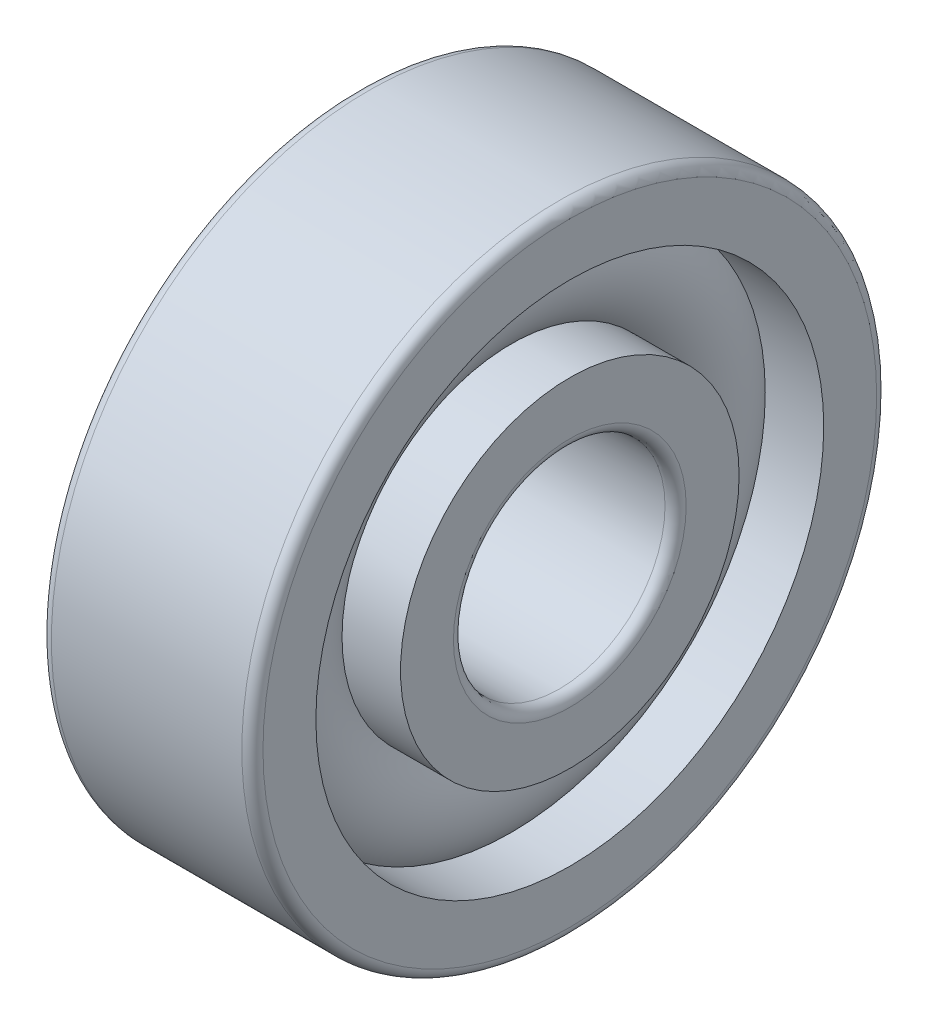
ISO-10303-21;
HEADER;
FILE_DESCRIPTION(('STEP AP214'),'2;1');
FILE_NAME('part.step','',(''),(''),'','','');
FILE_SCHEMA(('AUTOMOTIVE_DESIGN { 1 0 10303 214 1 1 1 1 }'));
ENDSEC;
DATA;
#1=APPLICATION_CONTEXT('core data for automotive mechanical design processes');
#2=APPLICATION_PROTOCOL_DEFINITION('international standard','automotive_design',2000,#1);
#3=PRODUCT_CONTEXT('',#1,'mechanical');
#4=PRODUCT('Part','Part','',(#3));
#5=PRODUCT_RELATED_PRODUCT_CATEGORY('part','',(#4));
#6=PRODUCT_DEFINITION_FORMATION('','',#4);
#7=PRODUCT_DEFINITION_CONTEXT('part definition',#1,'design');
#8=PRODUCT_DEFINITION('design','',#6,#7);
#9=PRODUCT_DEFINITION_SHAPE('','',#8);
#10=(LENGTH_UNIT() NAMED_UNIT(*) SI_UNIT(.MILLI.,.METRE.));
#11=(NAMED_UNIT(*) PLANE_ANGLE_UNIT() SI_UNIT($,.RADIAN.));
#12=(NAMED_UNIT(*) SI_UNIT($,.STERADIAN.) SOLID_ANGLE_UNIT());
#13=UNCERTAINTY_MEASURE_WITH_UNIT(LENGTH_MEASURE(1.E-05),#10,'distance_accuracy_value','');
#14=(GEOMETRIC_REPRESENTATION_CONTEXT(3) GLOBAL_UNCERTAINTY_ASSIGNED_CONTEXT((#13)) GLOBAL_UNIT_ASSIGNED_CONTEXT((#10,
#11,#12)) REPRESENTATION_CONTEXT('',''));
#15=CARTESIAN_POINT('',(0.,0.,0.));
#16=DIRECTION('',(0.,0.,1.));
#17=DIRECTION('',(1.,0.,0.));
#18=AXIS2_PLACEMENT_3D('',#15,#16,#17);
#19=CARTESIAN_POINT('',(0.,0.,0.));
#20=DIRECTION('',(-1.,0.,0.));
#21=DIRECTION('',(0.,0.,1.));
#22=AXIS2_PLACEMENT_3D('',#19,#20,#21);
#23=TOROIDAL_SURFACE('',#22,4.,1.2);
#24=CARTESIAN_POINT('',(0.894427190999912,0.,0.));
#25=DIRECTION('',(-1.,0.,0.));
#26=DIRECTION('',(0.,0.,1.));
#27=AXIS2_PLACEMENT_3D('',#24,#25,#26);
#28=CIRCLE('',#27,4.8);
#29=CARTESIAN_POINT('',(0.894427190999912,0.,4.8));
#30=VERTEX_POINT('',#29);
#31=EDGE_CURVE('E35',#30,#30,#28,.F.);
#32=ORIENTED_EDGE('',*,*,#31,.T.);
#33=EDGE_LOOP('',(#32));
#34=FACE_BOUND('',#33,.T.);
#35=CARTESIAN_POINT('',(0.894427190999916,0.,0.));
#36=DIRECTION('',(-1.,0.,0.));
#37=DIRECTION('',(0.,0.,1.));
#38=AXIS2_PLACEMENT_3D('',#35,#36,#37);
#39=CIRCLE('',#38,3.2);
#40=CARTESIAN_POINT('',(0.894427190999916,0.,3.2));
#41=VERTEX_POINT('',#40);
#42=EDGE_CURVE('E10',#41,#41,#39,.T.);
#43=ORIENTED_EDGE('',*,*,#42,.T.);
#44=EDGE_LOOP('',(#43));
#45=FACE_BOUND('',#44,.T.);
#46=ADVANCED_FACE('F31',(#34,#45),#23,.T.);
#47=CARTESIAN_POINT('',(-20.6375,0.,0.));
#48=DIRECTION('',(1.,0.,0.));
#49=DIRECTION('',(0.,0.,-1.));
#50=AXIS2_PLACEMENT_3D('',#47,#48,#49);
#51=CYLINDRICAL_SURFACE('',#50,3.2);
#52=CARTESIAN_POINT('',(2.,0.,0.));
#53=DIRECTION('',(1.,0.,0.));
#54=DIRECTION('',(0.,0.,-1.));
#55=AXIS2_PLACEMENT_3D('',#52,#53,#54);
#56=CIRCLE('',#55,3.2);
#57=CARTESIAN_POINT('',(2.,0.,-3.2));
#58=VERTEX_POINT('',#57);
#59=EDGE_CURVE('E44',#58,#58,#56,.T.);
#60=ORIENTED_EDGE('',*,*,#59,.F.);
#61=EDGE_LOOP('',(#60));
#62=FACE_BOUND('',#61,.T.);
#63=ORIENTED_EDGE('',*,*,#42,.F.);
#64=EDGE_LOOP('',(#63));
#65=FACE_BOUND('',#64,.T.);
#66=ADVANCED_FACE('F83',(#62,#65),#51,.T.);
#67=CARTESIAN_POINT('',(-20.6375,0.,0.));
#68=DIRECTION('',(1.,0.,0.));
#69=DIRECTION('',(0.,0.,-1.));
#70=AXIS2_PLACEMENT_3D('',#67,#68,#69);
#71=CYLINDRICAL_SURFACE('',#70,3.2);
#72=CARTESIAN_POINT('',(-2.,0.,0.));
#73=DIRECTION('',(1.,0.,0.));
#74=DIRECTION('',(0.,0.,-1.));
#75=AXIS2_PLACEMENT_3D('',#72,#73,#74);
#76=CIRCLE('',#75,3.2);
#77=CARTESIAN_POINT('',(-2.,0.,-3.2));
#78=VERTEX_POINT('',#77);
#79=EDGE_CURVE('E53',#78,#78,#76,.T.);
#80=ORIENTED_EDGE('',*,*,#79,.T.);
#81=EDGE_LOOP('',(#80));
#82=FACE_BOUND('',#81,.T.);
#83=CARTESIAN_POINT('',(-0.894427190999916,0.,0.));
#84=DIRECTION('',(1.,0.,0.));
#85=DIRECTION('',(0.,0.,-1.));
#86=AXIS2_PLACEMENT_3D('',#83,#84,#85);
#87=CIRCLE('',#86,3.2);
#88=CARTESIAN_POINT('',(-0.894427190999916,0.,-3.2));
#89=VERTEX_POINT('',#88);
#90=EDGE_CURVE('E39',#89,#89,#87,.T.);
#91=ORIENTED_EDGE('',*,*,#90,.F.);
#92=EDGE_LOOP('',(#91));
#93=FACE_BOUND('',#92,.T.);
#94=ADVANCED_FACE('F86',(#82,#93),#71,.T.);
#95=CARTESIAN_POINT('',(2.,2.2,0.));
#96=DIRECTION('',(1.,0.,0.));
#97=DIRECTION('',(0.,0.,-1.));
#98=AXIS2_PLACEMENT_3D('',#95,#96,#97);
#99=PLANE('',#98);
#100=ORIENTED_EDGE('',*,*,#59,.T.);
#101=EDGE_LOOP('',(#100));
#102=FACE_BOUND('',#101,.T.);
#103=CARTESIAN_POINT('',(2.,0.,0.));
#104=DIRECTION('',(1.,0.,0.));
#105=DIRECTION('',(0.,0.,-1.));
#106=AXIS2_PLACEMENT_3D('',#103,#104,#105);
#107=CIRCLE('',#106,2.2);
#108=CARTESIAN_POINT('',(2.,0.,-2.2));
#109=VERTEX_POINT('',#108);
#110=EDGE_CURVE('E75',#109,#109,#107,.T.);
#111=ORIENTED_EDGE('',*,*,#110,.F.);
#112=EDGE_LOOP('',(#111));
#113=FACE_BOUND('',#112,.T.);
#114=ADVANCED_FACE('F80',(#102,#113),#99,.T.);
#115=CARTESIAN_POINT('',(1.8,0.,0.));
#116=DIRECTION('',(1.,0.,0.));
#117=DIRECTION('',(0.,0.,-1.));
#118=AXIS2_PLACEMENT_3D('',#115,#116,#117);
#119=TOROIDAL_SURFACE('',#118,2.2,0.2);
#120=ORIENTED_EDGE('',*,*,#110,.T.);
#121=EDGE_LOOP('',(#120));
#122=FACE_BOUND('',#121,.T.);
#123=CARTESIAN_POINT('',(1.8,0.,0.));
#124=DIRECTION('',(1.,0.,0.));
#125=DIRECTION('',(0.,0.,-1.));
#126=AXIS2_PLACEMENT_3D('',#123,#124,#125);
#127=CIRCLE('',#126,2.);
#128=CARTESIAN_POINT('',(1.8,0.,-2.));
#129=VERTEX_POINT('',#128);
#130=EDGE_CURVE('E72',#129,#129,#127,.T.);
#131=ORIENTED_EDGE('',*,*,#130,.F.);
#132=EDGE_LOOP('',(#131));
#133=FACE_BOUND('',#132,.T.);
#134=ADVANCED_FACE('F97',(#122,#133),#119,.T.);
#135=CARTESIAN_POINT('',(-20.6375,0.,0.));
#136=DIRECTION('',(1.,0.,0.));
#137=DIRECTION('',(0.,0.,-1.));
#138=AXIS2_PLACEMENT_3D('',#135,#136,#137);
#139=CYLINDRICAL_SURFACE('',#138,2.);
#140=ORIENTED_EDGE('',*,*,#130,.T.);
#141=EDGE_LOOP('',(#140));
#142=FACE_BOUND('',#141,.T.);
#143=CARTESIAN_POINT('',(-1.8,0.,0.));
#144=DIRECTION('',(1.,0.,0.));
#145=DIRECTION('',(0.,0.,-1.));
#146=AXIS2_PLACEMENT_3D('',#143,#144,#145);
#147=CIRCLE('',#146,2.);
#148=CARTESIAN_POINT('',(-1.8,0.,-2.));
#149=VERTEX_POINT('',#148);
#150=EDGE_CURVE('E69',#149,#149,#147,.T.);
#151=ORIENTED_EDGE('',*,*,#150,.F.);
#152=EDGE_LOOP('',(#151));
#153=FACE_BOUND('',#152,.T.);
#154=ADVANCED_FACE('F100',(#142,#153),#139,.F.);
#155=CARTESIAN_POINT('',(-1.8,0.,0.));
#156=DIRECTION('',(1.,0.,0.));
#157=DIRECTION('',(0.,0.,-1.));
#158=AXIS2_PLACEMENT_3D('',#155,#156,#157);
#159=TOROIDAL_SURFACE('',#158,2.2,0.2);
#160=ORIENTED_EDGE('',*,*,#150,.T.);
#161=EDGE_LOOP('',(#160));
#162=FACE_BOUND('',#161,.T.);
#163=CARTESIAN_POINT('',(-2.,0.,0.));
#164=DIRECTION('',(1.,0.,0.));
#165=DIRECTION('',(0.,0.,-1.));
#166=AXIS2_PLACEMENT_3D('',#163,#164,#165);
#167=CIRCLE('',#166,2.2);
#168=CARTESIAN_POINT('',(-2.,0.,-2.2));
#169=VERTEX_POINT('',#168);
#170=EDGE_CURVE('E66',#169,#169,#167,.T.);
#171=ORIENTED_EDGE('',*,*,#170,.F.);
#172=EDGE_LOOP('',(#171));
#173=FACE_BOUND('',#172,.T.);
#174=ADVANCED_FACE('F104',(#162,#173),#159,.T.);
#175=CARTESIAN_POINT('',(-2.,3.2,0.));
#176=DIRECTION('',(-1.,0.,0.));
#177=DIRECTION('',(0.,0.,1.));
#178=AXIS2_PLACEMENT_3D('',#175,#176,#177);
#179=PLANE('',#178);
#180=ORIENTED_EDGE('',*,*,#170,.T.);
#181=EDGE_LOOP('',(#180));
#182=FACE_BOUND('',#181,.T.);
#183=ORIENTED_EDGE('',*,*,#79,.F.);
#184=EDGE_LOOP('',(#183));
#185=FACE_BOUND('',#184,.T.);
#186=ADVANCED_FACE('F108',(#182,#185),#179,.T.);
#187=CARTESIAN_POINT('',(-0.894427190999912,0.,0.));
#188=DIRECTION('',(1.,0.,0.));
#189=DIRECTION('',(0.,0.,-1.));
#190=AXIS2_PLACEMENT_3D('',#187,#188,#189);
#191=CIRCLE('',#190,4.8);
#192=CARTESIAN_POINT('',(-0.894427190999912,0.,-4.8));
#193=VERTEX_POINT('',#192);
#194=EDGE_CURVE('E47',#193,#193,#191,.F.);
#195=ORIENTED_EDGE('',*,*,#194,.T.);
#196=EDGE_LOOP('',(#195));
#197=FACE_BOUND('',#196,.T.);
#198=ORIENTED_EDGE('',*,*,#90,.T.);
#199=EDGE_LOOP('',(#198));
#200=FACE_BOUND('',#199,.T.);
#201=ADVANCED_FACE('F33',(#197,#200),#23,.T.);
#202=CARTESIAN_POINT('',(-20.6375,0.,0.));
#203=DIRECTION('',(1.,0.,0.));
#204=DIRECTION('',(0.,0.,-1.));
#205=AXIS2_PLACEMENT_3D('',#202,#203,#204);
#206=CYLINDRICAL_SURFACE('',#205,4.8);
#207=CARTESIAN_POINT('',(2.,0.,0.));
#208=DIRECTION('',(1.,0.,0.));
#209=DIRECTION('',(0.,0.,-1.));
#210=AXIS2_PLACEMENT_3D('',#207,#208,#209);
#211=CIRCLE('',#210,4.8);
#212=CARTESIAN_POINT('',(2.,0.,-4.8));
#213=VERTEX_POINT('',#212);
#214=EDGE_CURVE('E49',#213,#213,#211,.T.);
#215=ORIENTED_EDGE('',*,*,#214,.T.);
#216=EDGE_LOOP('',(#215));
#217=FACE_BOUND('',#216,.T.);
#218=ORIENTED_EDGE('',*,*,#31,.F.);
#219=EDGE_LOOP('',(#218));
#220=FACE_BOUND('',#219,.T.);
#221=ADVANCED_FACE('F113',(#217,#220),#206,.F.);
#222=CARTESIAN_POINT('',(-20.6375,0.,0.));
#223=DIRECTION('',(1.,0.,0.));
#224=DIRECTION('',(0.,0.,-1.));
#225=AXIS2_PLACEMENT_3D('',#222,#223,#224);
#226=CYLINDRICAL_SURFACE('',#225,4.8);
#227=CARTESIAN_POINT('',(-2.,0.,0.));
#228=DIRECTION('',(1.,0.,0.));
#229=DIRECTION('',(0.,0.,-1.));
#230=AXIS2_PLACEMENT_3D('',#227,#228,#229);
#231=CIRCLE('',#230,4.8);
#232=CARTESIAN_POINT('',(-2.,0.,-4.8));
#233=VERTEX_POINT('',#232);
#234=EDGE_CURVE('E144',#233,#233,#231,.T.);
#235=ORIENTED_EDGE('',*,*,#234,.F.);
#236=EDGE_LOOP('',(#235));
#237=FACE_BOUND('',#236,.T.);
#238=ORIENTED_EDGE('',*,*,#194,.F.);
#239=EDGE_LOOP('',(#238));
#240=FACE_BOUND('',#239,.T.);
#241=ADVANCED_FACE('F116',(#237,#240),#226,.F.);
#242=CARTESIAN_POINT('',(2.,5.80000000000001,0.));
#243=DIRECTION('',(1.,0.,0.));
#244=DIRECTION('',(0.,0.,-1.));
#245=AXIS2_PLACEMENT_3D('',#242,#243,#244);
#246=PLANE('',#245);
#247=CARTESIAN_POINT('',(2.,0.,0.));
#248=DIRECTION('',(1.,0.,0.));
#249=DIRECTION('',(0.,0.,-1.));
#250=AXIS2_PLACEMENT_3D('',#247,#248,#249);
#251=CIRCLE('',#250,5.80000000000001);
#252=CARTESIAN_POINT('',(2.,0.,-5.80000000000001));
#253=VERTEX_POINT('',#252);
#254=EDGE_CURVE('E55',#253,#253,#251,.T.);
#255=ORIENTED_EDGE('',*,*,#254,.T.);
#256=EDGE_LOOP('',(#255));
#257=FACE_BOUND('',#256,.T.);
#258=ORIENTED_EDGE('',*,*,#214,.F.);
#259=EDGE_LOOP('',(#258));
#260=FACE_BOUND('',#259,.T.);
#261=ADVANCED_FACE('F117',(#257,#260),#246,.T.);
#262=CARTESIAN_POINT('',(1.8,0.,0.));
#263=DIRECTION('',(1.,0.,0.));
#264=DIRECTION('',(0.,0.,-1.));
#265=AXIS2_PLACEMENT_3D('',#262,#263,#264);
#266=TOROIDAL_SURFACE('',#265,5.80000000000001,0.2);
#267=CARTESIAN_POINT('',(1.8,0.,0.));
#268=DIRECTION('',(1.,0.,0.));
#269=DIRECTION('',(0.,0.,-1.));
#270=AXIS2_PLACEMENT_3D('',#267,#268,#269);
#271=CIRCLE('',#270,6.);
#272=CARTESIAN_POINT('',(1.8,0.,-6.));
#273=VERTEX_POINT('',#272);
#274=EDGE_CURVE('E60',#273,#273,#271,.T.);
#275=ORIENTED_EDGE('',*,*,#274,.T.);
#276=EDGE_LOOP('',(#275));
#277=FACE_BOUND('',#276,.T.);
#278=ORIENTED_EDGE('',*,*,#254,.F.);
#279=EDGE_LOOP('',(#278));
#280=FACE_BOUND('',#279,.T.);
#281=ADVANCED_FACE('F120',(#277,#280),#266,.T.);
#282=CARTESIAN_POINT('',(-20.6375,0.,0.));
#283=DIRECTION('',(1.,0.,0.));
#284=DIRECTION('',(0.,0.,-1.));
#285=AXIS2_PLACEMENT_3D('',#282,#283,#284);
#286=CYLINDRICAL_SURFACE('',#285,6.00000000000001);
#287=CARTESIAN_POINT('',(-1.8,0.,0.));
#288=DIRECTION('',(1.,0.,0.));
#289=DIRECTION('',(0.,0.,-1.));
#290=AXIS2_PLACEMENT_3D('',#287,#288,#289);
#291=CIRCLE('',#290,6.00000000000001);
#292=CARTESIAN_POINT('',(-1.8,0.,-6.00000000000001));
#293=VERTEX_POINT('',#292);
#294=EDGE_CURVE('E148',#293,#293,#291,.T.);
#295=ORIENTED_EDGE('',*,*,#294,.T.);
#296=EDGE_LOOP('',(#295));
#297=FACE_BOUND('',#296,.T.);
#298=ORIENTED_EDGE('',*,*,#274,.F.);
#299=EDGE_LOOP('',(#298));
#300=FACE_BOUND('',#299,.T.);
#301=ADVANCED_FACE('F124',(#297,#300),#286,.T.);
#302=CARTESIAN_POINT('',(-1.8,0.,0.));
#303=DIRECTION('',(1.,0.,0.));
#304=DIRECTION('',(0.,0.,-1.));
#305=AXIS2_PLACEMENT_3D('',#302,#303,#304);
#306=TOROIDAL_SURFACE('',#305,5.80000000000001,0.2);
#307=CARTESIAN_POINT('',(-2.,0.,0.));
#308=DIRECTION('',(1.,0.,0.));
#309=DIRECTION('',(0.,0.,-1.));
#310=AXIS2_PLACEMENT_3D('',#307,#308,#309);
#311=CIRCLE('',#310,5.80000000000001);
#312=CARTESIAN_POINT('',(-2.,0.,-5.80000000000001));
#313=VERTEX_POINT('',#312);
#314=EDGE_CURVE('E145',#313,#313,#311,.T.);
#315=ORIENTED_EDGE('',*,*,#314,.T.);
#316=EDGE_LOOP('',(#315));
#317=FACE_BOUND('',#316,.T.);
#318=ORIENTED_EDGE('',*,*,#294,.F.);
#319=EDGE_LOOP('',(#318));
#320=FACE_BOUND('',#319,.T.);
#321=ADVANCED_FACE('F128',(#317,#320),#306,.T.);
#322=CARTESIAN_POINT('',(-2.,4.8,0.));
#323=DIRECTION('',(-1.,0.,0.));
#324=DIRECTION('',(0.,0.,1.));
#325=AXIS2_PLACEMENT_3D('',#322,#323,#324);
#326=PLANE('',#325);
#327=ORIENTED_EDGE('',*,*,#234,.T.);
#328=EDGE_LOOP('',(#327));
#329=FACE_BOUND('',#328,.T.);
#330=ORIENTED_EDGE('',*,*,#314,.F.);
#331=EDGE_LOOP('',(#330));
#332=FACE_BOUND('',#331,.T.);
#333=ADVANCED_FACE('F132',(#329,#332),#326,.T.);
#334=CLOSED_SHELL('',(#46,#66,#94,#114,#134,#154,#174,#186,#201,#221,#241,#261,#281,#301,#321,#333));
#335=MANIFOLD_SOLID_BREP('B2',#334);
#336=ADVANCED_BREP_SHAPE_REPRESENTATION('',(#18,#335),#14);
#337=SHAPE_DEFINITION_REPRESENTATION(#9,#336);
ENDSEC;
END-ISO-10303-21;
